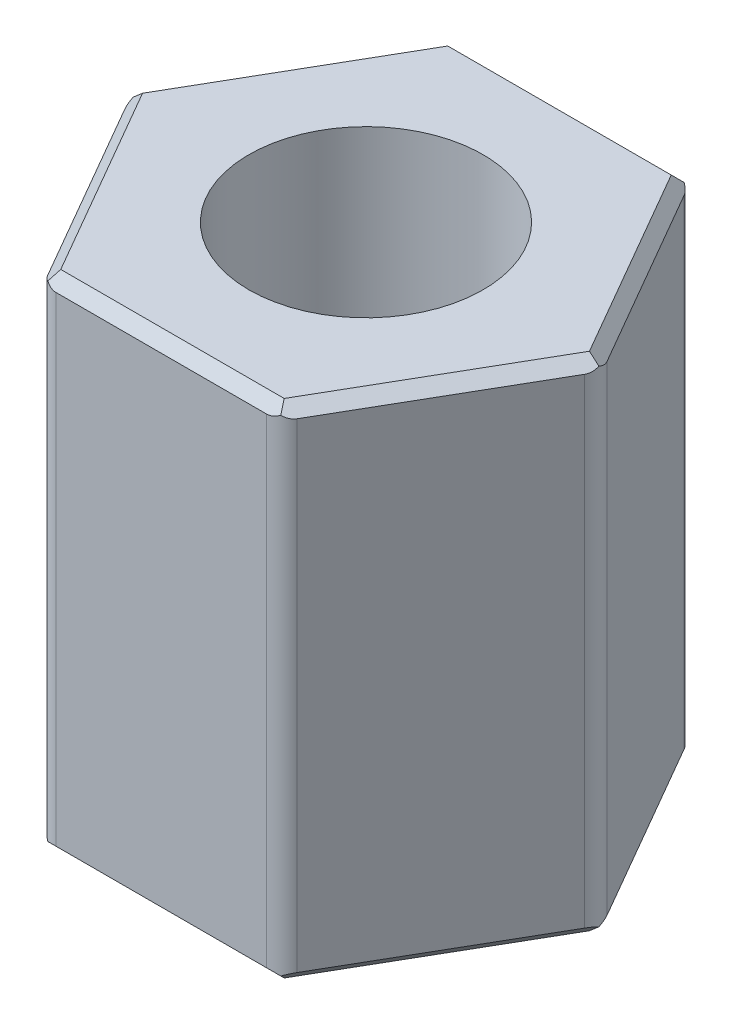
ISO-10303-21;
HEADER;
FILE_DESCRIPTION(('STEP AP214'),'2;1');
FILE_NAME('part.step','',(''),(''),'','','');
FILE_SCHEMA(('AUTOMOTIVE_DESIGN { 1 0 10303 214 1 1 1 1 }'));
ENDSEC;
DATA;
#1=APPLICATION_CONTEXT('core data for automotive mechanical design processes');
#2=APPLICATION_PROTOCOL_DEFINITION('international standard','automotive_design',2000,#1);
#3=PRODUCT_CONTEXT('',#1,'mechanical');
#4=PRODUCT('Part','Part','',(#3));
#5=PRODUCT_RELATED_PRODUCT_CATEGORY('part','',(#4));
#6=PRODUCT_DEFINITION_FORMATION('','',#4);
#7=PRODUCT_DEFINITION_CONTEXT('part definition',#1,'design');
#8=PRODUCT_DEFINITION('design','',#6,#7);
#9=PRODUCT_DEFINITION_SHAPE('','',#8);
#10=(LENGTH_UNIT() NAMED_UNIT(*) SI_UNIT(.MILLI.,.METRE.));
#11=(NAMED_UNIT(*) PLANE_ANGLE_UNIT() SI_UNIT($,.RADIAN.));
#12=(NAMED_UNIT(*) SI_UNIT($,.STERADIAN.) SOLID_ANGLE_UNIT());
#13=UNCERTAINTY_MEASURE_WITH_UNIT(LENGTH_MEASURE(1.E-05),#10,'distance_accuracy_value','');
#14=(GEOMETRIC_REPRESENTATION_CONTEXT(3) GLOBAL_UNCERTAINTY_ASSIGNED_CONTEXT((#13)) GLOBAL_UNIT_ASSIGNED_CONTEXT((#10,
#11,#12)) REPRESENTATION_CONTEXT('',''));
#15=CARTESIAN_POINT('',(0.,0.,0.));
#16=DIRECTION('',(0.,0.,1.));
#17=DIRECTION('',(1.,0.,0.));
#18=AXIS2_PLACEMENT_3D('',#15,#16,#17);
#19=CARTESIAN_POINT('',(0.,11.43,0.));
#20=DIRECTION('',(0.,1.,0.));
#21=DIRECTION('',(0.,0.,1.));
#22=AXIS2_PLACEMENT_3D('',#19,#20,#21);
#23=PLANE('',#22);
#24=DIRECTION('',(-1.,0.,0.));
#25=VECTOR('',#24,1.);
#26=CARTESIAN_POINT('',(-2.69097186966593,11.43,-4.4069));
#27=LINE('',#26,#25);
#28=CARTESIAN_POINT('',(2.54432490129176,11.43,-4.4069));
#29=VERTEX_POINT('',#28);
#30=CARTESIAN_POINT('',(-2.54432490129176,11.43,-4.4069));
#31=VERTEX_POINT('',#30);
#32=EDGE_CURVE('E266',#29,#31,#27,.T.);
#33=ORIENTED_EDGE('',*,*,#32,.T.);
#34=DIRECTION('',(-0.5,0.,0.866025403784439));
#35=VECTOR('',#34,1.);
#36=CARTESIAN_POINT('',(-5.1619732867706,11.43,0.127));
#37=LINE('',#36,#35);
#38=CARTESIAN_POINT('',(-5.08864980258352,11.43,0.));
#39=VERTEX_POINT('',#38);
#40=EDGE_CURVE('E268',#31,#39,#37,.T.);
#41=ORIENTED_EDGE('',*,*,#40,.T.);
#42=DIRECTION('',(0.5,0.,0.866025403784439));
#43=VECTOR('',#42,1.);
#44=CARTESIAN_POINT('',(-2.47100141710468,11.43,4.5339));
#45=LINE('',#44,#43);
#46=CARTESIAN_POINT('',(-2.54432490129176,11.43,4.4069));
#47=VERTEX_POINT('',#46);
#48=EDGE_CURVE('E261',#39,#47,#45,.T.);
#49=ORIENTED_EDGE('',*,*,#48,.T.);
#50=DIRECTION('',(1.,0.,0.));
#51=VECTOR('',#50,1.);
#52=CARTESIAN_POINT('',(2.69097186966593,11.43,4.4069));
#53=LINE('',#52,#51);
#54=CARTESIAN_POINT('',(2.54432490129176,11.43,4.4069));
#55=VERTEX_POINT('',#54);
#56=EDGE_CURVE('E258',#47,#55,#53,.T.);
#57=ORIENTED_EDGE('',*,*,#56,.T.);
#58=DIRECTION('',(0.5,0.,-0.866025403784439));
#59=VECTOR('',#58,1.);
#60=CARTESIAN_POINT('',(5.1619732867706,11.43,-0.127000000000001));
#61=LINE('',#60,#59);
#62=CARTESIAN_POINT('',(5.08864980258352,11.43,0.));
#63=VERTEX_POINT('',#62);
#64=EDGE_CURVE('E256',#55,#63,#61,.T.);
#65=ORIENTED_EDGE('',*,*,#64,.T.);
#66=DIRECTION('',(-0.5,0.,-0.866025403784439));
#67=VECTOR('',#66,1.);
#68=CARTESIAN_POINT('',(2.47100141710467,11.43,-4.5339));
#69=LINE('',#68,#67);
#70=EDGE_CURVE('E264',#63,#29,#69,.T.);
#71=ORIENTED_EDGE('',*,*,#70,.T.);
#72=EDGE_LOOP('',(#33,#41,#49,#57,#65,#71));
#73=FACE_BOUND('',#72,.T.);
#74=CARTESIAN_POINT('',(0.,11.43,0.));
#75=DIRECTION('',(0.,1.,0.));
#76=DIRECTION('',(0.,0.,1.));
#77=AXIS2_PLACEMENT_3D('',#74,#75,#76);
#78=CIRCLE('',#77,2.667);
#79=CARTESIAN_POINT('',(0.,11.43,2.667));
#80=VERTEX_POINT('',#79);
#81=EDGE_CURVE('E427',#80,#80,#78,.T.);
#82=ORIENTED_EDGE('',*,*,#81,.F.);
#83=EDGE_LOOP('',(#82));
#84=FACE_BOUND('',#83,.T.);
#85=ADVANCED_FACE('F33',(#73,#84),#23,.T.);
#86=CARTESIAN_POINT('',(0.,0.,0.));
#87=DIRECTION('',(0.,1.,0.));
#88=DIRECTION('',(0.,0.,1.));
#89=AXIS2_PLACEMENT_3D('',#86,#87,#88);
#90=PLANE('',#89);
#91=DIRECTION('',(0.5,0.,0.866025403784439));
#92=VECTOR('',#91,1.);
#93=CARTESIAN_POINT('',(3.81648735193764,0.,-2.20345));
#94=LINE('',#93,#92);
#95=CARTESIAN_POINT('',(2.54432490129176,0.,-4.4069));
#96=VERTEX_POINT('',#95);
#97=CARTESIAN_POINT('',(5.08864980258352,0.,0.));
#98=VERTEX_POINT('',#97);
#99=EDGE_CURVE('E222',#96,#98,#94,.T.);
#100=ORIENTED_EDGE('',*,*,#99,.T.);
#101=DIRECTION('',(-0.5,0.,0.866025403784439));
#102=VECTOR('',#101,1.);
#103=CARTESIAN_POINT('',(3.81648735193764,0.,2.20345));
#104=LINE('',#103,#102);
#105=CARTESIAN_POINT('',(2.54432490129176,0.,4.4069));
#106=VERTEX_POINT('',#105);
#107=EDGE_CURVE('E199',#98,#106,#104,.T.);
#108=ORIENTED_EDGE('',*,*,#107,.T.);
#109=DIRECTION('',(-1.,0.,0.));
#110=VECTOR('',#109,1.);
#111=CARTESIAN_POINT('',(0.,0.,4.4069));
#112=LINE('',#111,#110);
#113=CARTESIAN_POINT('',(-2.54432490129176,0.,4.4069));
#114=VERTEX_POINT('',#113);
#115=EDGE_CURVE('E209',#106,#114,#112,.T.);
#116=ORIENTED_EDGE('',*,*,#115,.T.);
#117=DIRECTION('',(-0.5,0.,-0.866025403784439));
#118=VECTOR('',#117,1.);
#119=CARTESIAN_POINT('',(-3.81648735193764,0.,2.20345));
#120=LINE('',#119,#118);
#121=CARTESIAN_POINT('',(-5.08864980258353,0.,0.));
#122=VERTEX_POINT('',#121);
#123=EDGE_CURVE('E216',#114,#122,#120,.T.);
#124=ORIENTED_EDGE('',*,*,#123,.T.);
#125=DIRECTION('',(0.5,0.,-0.866025403784439));
#126=VECTOR('',#125,1.);
#127=CARTESIAN_POINT('',(-3.81648735193764,0.,-2.20345));
#128=LINE('',#127,#126);
#129=CARTESIAN_POINT('',(-2.54432490129176,0.,-4.4069));
#130=VERTEX_POINT('',#129);
#131=EDGE_CURVE('E434',#122,#130,#128,.T.);
#132=ORIENTED_EDGE('',*,*,#131,.T.);
#133=DIRECTION('',(1.,0.,0.));
#134=VECTOR('',#133,1.);
#135=CARTESIAN_POINT('',(0.,0.,-4.4069));
#136=LINE('',#135,#134);
#137=EDGE_CURVE('E228',#130,#96,#136,.T.);
#138=ORIENTED_EDGE('',*,*,#137,.T.);
#139=EDGE_LOOP('',(#100,#108,#116,#124,#132,#138));
#140=FACE_BOUND('',#139,.T.);
#141=CARTESIAN_POINT('',(0.,0.,0.));
#142=DIRECTION('',(0.,1.,0.));
#143=DIRECTION('',(0.,0.,1.));
#144=AXIS2_PLACEMENT_3D('',#141,#142,#143);
#145=CIRCLE('',#144,2.667);
#146=CARTESIAN_POINT('',(0.,0.,2.667));
#147=VERTEX_POINT('',#146);
#148=EDGE_CURVE('E282',#147,#147,#145,.T.);
#149=ORIENTED_EDGE('',*,*,#148,.T.);
#150=EDGE_LOOP('',(#149));
#151=FACE_BOUND('',#150,.T.);
#152=ADVANCED_FACE('F219',(#140,#151),#90,.F.);
#153=CARTESIAN_POINT('',(-2.69097186966593,11.43,4.6609));
#154=DIRECTION('',(0.,0.,-1.));
#155=DIRECTION('',(-1.,0.,0.));
#156=AXIS2_PLACEMENT_3D('',#153,#154,#155);
#157=PLANE('',#156);
#158=DIRECTION('',(1.,0.,0.));
#159=VECTOR('',#158,1.);
#160=CARTESIAN_POINT('',(-2.69097186966593,0.253999999999999,4.6609));
#161=LINE('',#160,#159);
#162=CARTESIAN_POINT('',(-2.3976779329176,0.253999999999999,4.6609));
#163=VERTEX_POINT('',#162);
#164=CARTESIAN_POINT('',(2.3976779329176,0.253999999999999,4.6609));
#165=VERTEX_POINT('',#164);
#166=EDGE_CURVE('E253',#163,#165,#161,.T.);
#167=ORIENTED_EDGE('',*,*,#166,.T.);
#168=DIRECTION('',(0.,-1.,0.));
#169=VECTOR('',#168,1.);
#170=CARTESIAN_POINT('',(2.3976779329176,11.43,4.6609));
#171=LINE('',#170,#169);
#172=CARTESIAN_POINT('',(2.3976779329176,11.176,4.6609));
#173=VERTEX_POINT('',#172);
#174=EDGE_CURVE('E327',#165,#173,#171,.F.);
#175=ORIENTED_EDGE('',*,*,#174,.T.);
#176=DIRECTION('',(-1.,0.,0.));
#177=VECTOR('',#176,1.);
#178=CARTESIAN_POINT('',(-2.69097186966593,11.176,4.6609));
#179=LINE('',#178,#177);
#180=CARTESIAN_POINT('',(-2.3976779329176,11.176,4.6609));
#181=VERTEX_POINT('',#180);
#182=EDGE_CURVE('E250',#173,#181,#179,.T.);
#183=ORIENTED_EDGE('',*,*,#182,.T.);
#184=DIRECTION('',(0.,-1.,0.));
#185=VECTOR('',#184,1.);
#186=CARTESIAN_POINT('',(-2.3976779329176,11.43,4.6609));
#187=LINE('',#186,#185);
#188=EDGE_CURVE('E324',#181,#163,#187,.T.);
#189=ORIENTED_EDGE('',*,*,#188,.T.);
#190=EDGE_LOOP('',(#167,#175,#183,#189));
#191=FACE_BOUND('',#190,.T.);
#192=ADVANCED_FACE('F465',(#191),#157,.F.);
#193=CARTESIAN_POINT('',(2.69097186966593,11.43,4.6609));
#194=DIRECTION('',(-0.866025403784439,0.,-0.5));
#195=DIRECTION('',(-0.5,0.,0.866025403784439));
#196=AXIS2_PLACEMENT_3D('',#193,#194,#195);
#197=PLANE('',#196);
#198=DIRECTION('',(0.5,0.,-0.866025403784439));
#199=VECTOR('',#198,1.);
#200=CARTESIAN_POINT('',(2.69097186966593,0.253999999999999,4.6609));
#201=LINE('',#200,#199);
#202=CARTESIAN_POINT('',(2.83761883804009,0.253999999999999,4.4069));
#203=VERTEX_POINT('',#202);
#204=CARTESIAN_POINT('',(5.23529677095769,0.253999999999999,0.253999999999999));
#205=VERTEX_POINT('',#204);
#206=EDGE_CURVE('E217',#203,#205,#201,.T.);
#207=ORIENTED_EDGE('',*,*,#206,.T.);
#208=DIRECTION('',(0.,-1.,0.));
#209=VECTOR('',#208,1.);
#210=CARTESIAN_POINT('',(5.23529677095769,11.43,0.254000000000001));
#211=LINE('',#210,#209);
#212=CARTESIAN_POINT('',(5.23529677095769,11.176,0.253999999999999));
#213=VERTEX_POINT('',#212);
#214=EDGE_CURVE('E310',#205,#213,#211,.F.);
#215=ORIENTED_EDGE('',*,*,#214,.T.);
#216=DIRECTION('',(-0.5,0.,0.866025403784439));
#217=VECTOR('',#216,1.);
#218=CARTESIAN_POINT('',(2.69097186966593,11.176,4.6609));
#219=LINE('',#218,#217);
#220=CARTESIAN_POINT('',(2.83761883804009,11.176,4.4069));
#221=VERTEX_POINT('',#220);
#222=EDGE_CURVE('E419',#213,#221,#219,.T.);
#223=ORIENTED_EDGE('',*,*,#222,.T.);
#224=DIRECTION('',(0.,-1.,0.));
#225=VECTOR('',#224,1.);
#226=CARTESIAN_POINT('',(2.83761883804009,11.43,4.4069));
#227=LINE('',#226,#225);
#228=EDGE_CURVE('E307',#221,#203,#227,.T.);
#229=ORIENTED_EDGE('',*,*,#228,.T.);
#230=EDGE_LOOP('',(#207,#215,#223,#229));
#231=FACE_BOUND('',#230,.T.);
#232=ADVANCED_FACE('F415',(#231),#197,.F.);
#233=CARTESIAN_POINT('',(5.38194373933185,11.43,0.));
#234=DIRECTION('',(-0.866025403784438,0.,0.5));
#235=DIRECTION('',(0.5,0.,0.866025403784439));
#236=AXIS2_PLACEMENT_3D('',#233,#234,#235);
#237=PLANE('',#236);
#238=DIRECTION('',(0.5,0.,0.866025403784439));
#239=VECTOR('',#238,1.);
#240=CARTESIAN_POINT('',(5.38194373933185,11.176,0.));
#241=LINE('',#240,#239);
#242=CARTESIAN_POINT('',(2.83761883804009,11.176,-4.4069));
#243=VERTEX_POINT('',#242);
#244=CARTESIAN_POINT('',(5.23529677095769,11.176,-0.253999999999999));
#245=VERTEX_POINT('',#244);
#246=EDGE_CURVE('E223',#243,#245,#241,.T.);
#247=ORIENTED_EDGE('',*,*,#246,.T.);
#248=DIRECTION('',(0.,-1.,0.));
#249=VECTOR('',#248,1.);
#250=CARTESIAN_POINT('',(5.23529677095769,11.43,-0.253999999999999));
#251=LINE('',#250,#249);
#252=CARTESIAN_POINT('',(5.23529677095769,0.253999999999999,-0.253999999999999));
#253=VERTEX_POINT('',#252);
#254=EDGE_CURVE('E297',#245,#253,#251,.T.);
#255=ORIENTED_EDGE('',*,*,#254,.T.);
#256=DIRECTION('',(-0.5,0.,-0.866025403784439));
#257=VECTOR('',#256,1.);
#258=CARTESIAN_POINT('',(5.38194373933185,0.253999999999999,0.));
#259=LINE('',#258,#257);
#260=CARTESIAN_POINT('',(2.83761883804009,0.253999999999999,-4.4069));
#261=VERTEX_POINT('',#260);
#262=EDGE_CURVE('E226',#253,#261,#259,.T.);
#263=ORIENTED_EDGE('',*,*,#262,.T.);
#264=DIRECTION('',(0.,-1.,0.));
#265=VECTOR('',#264,1.);
#266=CARTESIAN_POINT('',(2.83761883804009,11.43,-4.4069));
#267=LINE('',#266,#265);
#268=EDGE_CURVE('E271',#261,#243,#267,.F.);
#269=ORIENTED_EDGE('',*,*,#268,.T.);
#270=EDGE_LOOP('',(#247,#255,#263,#269));
#271=FACE_BOUND('',#270,.T.);
#272=ADVANCED_FACE('F404',(#271),#237,.F.);
#273=CARTESIAN_POINT('',(2.69097186966592,11.43,-4.6609));
#274=DIRECTION('',(0.,0.,1.));
#275=DIRECTION('',(1.,0.,0.));
#276=AXIS2_PLACEMENT_3D('',#273,#274,#275);
#277=PLANE('',#276);
#278=DIRECTION('',(-1.,0.,0.));
#279=VECTOR('',#278,1.);
#280=CARTESIAN_POINT('',(2.69097186966592,0.253999999999999,-4.6609));
#281=LINE('',#280,#279);
#282=CARTESIAN_POINT('',(2.39767793291759,0.253999999999999,-4.6609));
#283=VERTEX_POINT('',#282);
#284=CARTESIAN_POINT('',(-2.3976779329176,0.253999999999999,-4.6609));
#285=VERTEX_POINT('',#284);
#286=EDGE_CURVE('E236',#283,#285,#281,.T.);
#287=ORIENTED_EDGE('',*,*,#286,.T.);
#288=DIRECTION('',(0.,-1.,0.));
#289=VECTOR('',#288,1.);
#290=CARTESIAN_POINT('',(-2.3976779329176,11.43,-4.6609));
#291=LINE('',#290,#289);
#292=CARTESIAN_POINT('',(-2.3976779329176,11.176,-4.6609));
#293=VERTEX_POINT('',#292);
#294=EDGE_CURVE('E54',#285,#293,#291,.F.);
#295=ORIENTED_EDGE('',*,*,#294,.T.);
#296=DIRECTION('',(1.,0.,0.));
#297=VECTOR('',#296,1.);
#298=CARTESIAN_POINT('',(2.69097186966592,11.176,-4.6609));
#299=LINE('',#298,#297);
#300=CARTESIAN_POINT('',(2.39767793291759,11.176,-4.6609));
#301=VERTEX_POINT('',#300);
#302=EDGE_CURVE('E234',#293,#301,#299,.T.);
#303=ORIENTED_EDGE('',*,*,#302,.T.);
#304=DIRECTION('',(0.,-1.,0.));
#305=VECTOR('',#304,1.);
#306=CARTESIAN_POINT('',(2.39767793291759,11.43,-4.6609));
#307=LINE('',#306,#305);
#308=EDGE_CURVE('E363',#301,#283,#307,.T.);
#309=ORIENTED_EDGE('',*,*,#308,.T.);
#310=EDGE_LOOP('',(#287,#295,#303,#309));
#311=FACE_BOUND('',#310,.T.);
#312=ADVANCED_FACE('F368',(#311),#277,.F.);
#313=CARTESIAN_POINT('',(-2.69097186966593,11.43,-4.6609));
#314=DIRECTION('',(0.866025403784439,0.,0.5));
#315=DIRECTION('',(0.5,0.,-0.866025403784439));
#316=AXIS2_PLACEMENT_3D('',#313,#314,#315);
#317=PLANE('',#316);
#318=DIRECTION('',(-0.5,0.,0.866025403784439));
#319=VECTOR('',#318,1.);
#320=CARTESIAN_POINT('',(-2.69097186966593,0.253999999999999,-4.6609));
#321=LINE('',#320,#319);
#322=CARTESIAN_POINT('',(-2.83761883804009,0.253999999999999,-4.4069));
#323=VERTEX_POINT('',#322);
#324=CARTESIAN_POINT('',(-5.23529677095769,0.253999999999999,-0.253999999999999));
#325=VERTEX_POINT('',#324);
#326=EDGE_CURVE('E241',#323,#325,#321,.T.);
#327=ORIENTED_EDGE('',*,*,#326,.T.);
#328=DIRECTION('',(0.,-1.,0.));
#329=VECTOR('',#328,1.);
#330=CARTESIAN_POINT('',(-5.23529677095769,11.43,-0.254000000000001));
#331=LINE('',#330,#329);
#332=CARTESIAN_POINT('',(-5.23529677095769,11.176,-0.253999999999999));
#333=VERTEX_POINT('',#332);
#334=EDGE_CURVE('E353',#325,#333,#331,.F.);
#335=ORIENTED_EDGE('',*,*,#334,.T.);
#336=DIRECTION('',(0.5,0.,-0.866025403784439));
#337=VECTOR('',#336,1.);
#338=CARTESIAN_POINT('',(-2.69097186966593,11.176,-4.6609));
#339=LINE('',#338,#337);
#340=CARTESIAN_POINT('',(-2.83761883804009,11.176,-4.4069));
#341=VERTEX_POINT('',#340);
#342=EDGE_CURVE('E238',#333,#341,#339,.T.);
#343=ORIENTED_EDGE('',*,*,#342,.T.);
#344=DIRECTION('',(0.,-1.,0.));
#345=VECTOR('',#344,1.);
#346=CARTESIAN_POINT('',(-2.83761883804009,11.43,-4.4069));
#347=LINE('',#346,#345);
#348=EDGE_CURVE('E350',#341,#323,#347,.T.);
#349=ORIENTED_EDGE('',*,*,#348,.T.);
#350=EDGE_LOOP('',(#327,#335,#343,#349));
#351=FACE_BOUND('',#350,.T.);
#352=ADVANCED_FACE('F443',(#351),#317,.F.);
#353=CARTESIAN_POINT('',(-5.38194373933185,11.43,0.));
#354=DIRECTION('',(0.866025403784439,0.,-0.5));
#355=DIRECTION('',(-0.5,0.,-0.866025403784439));
#356=AXIS2_PLACEMENT_3D('',#353,#354,#355);
#357=PLANE('',#356);
#358=DIRECTION('',(0.5,0.,0.866025403784439));
#359=VECTOR('',#358,1.);
#360=CARTESIAN_POINT('',(-5.38194373933185,0.253999999999999,0.));
#361=LINE('',#360,#359);
#362=CARTESIAN_POINT('',(-5.23529677095769,0.253999999999999,0.253999999999999));
#363=VERTEX_POINT('',#362);
#364=CARTESIAN_POINT('',(-2.83761883804009,0.253999999999999,4.4069));
#365=VERTEX_POINT('',#364);
#366=EDGE_CURVE('E247',#363,#365,#361,.T.);
#367=ORIENTED_EDGE('',*,*,#366,.T.);
#368=DIRECTION('',(0.,-1.,0.));
#369=VECTOR('',#368,1.);
#370=CARTESIAN_POINT('',(-2.83761883804009,11.43,4.4069));
#371=LINE('',#370,#369);
#372=CARTESIAN_POINT('',(-2.83761883804009,11.176,4.4069));
#373=VERTEX_POINT('',#372);
#374=EDGE_CURVE('E340',#365,#373,#371,.F.);
#375=ORIENTED_EDGE('',*,*,#374,.T.);
#376=DIRECTION('',(-0.5,0.,-0.866025403784439));
#377=VECTOR('',#376,1.);
#378=CARTESIAN_POINT('',(-5.38194373933185,11.176,0.));
#379=LINE('',#378,#377);
#380=CARTESIAN_POINT('',(-5.23529677095769,11.176,0.253999999999999));
#381=VERTEX_POINT('',#380);
#382=EDGE_CURVE('E244',#373,#381,#379,.T.);
#383=ORIENTED_EDGE('',*,*,#382,.T.);
#384=DIRECTION('',(0.,-1.,0.));
#385=VECTOR('',#384,1.);
#386=CARTESIAN_POINT('',(-5.23529677095769,11.43,0.253999999999999));
#387=LINE('',#386,#385);
#388=EDGE_CURVE('E337',#381,#363,#387,.T.);
#389=ORIENTED_EDGE('',*,*,#388,.T.);
#390=EDGE_LOOP('',(#367,#375,#383,#389));
#391=FACE_BOUND('',#390,.T.);
#392=ADVANCED_FACE('F487',(#391),#357,.F.);
#393=CARTESIAN_POINT('',(0.,11.43,0.));
#394=DIRECTION('',(0.,-1.,0.));
#395=DIRECTION('',(0.,0.,-1.));
#396=AXIS2_PLACEMENT_3D('',#393,#394,#395);
#397=CYLINDRICAL_SURFACE('',#396,2.667);
#398=ORIENTED_EDGE('',*,*,#81,.T.);
#399=EDGE_LOOP('',(#398));
#400=FACE_BOUND('',#399,.T.);
#401=ORIENTED_EDGE('',*,*,#148,.F.);
#402=EDGE_LOOP('',(#401));
#403=FACE_BOUND('',#402,.T.);
#404=ADVANCED_FACE('F485',(#400,#403),#397,.F.);
#405=CARTESIAN_POINT('',(-2.69097186966593,0.253999999999999,-4.6609));
#406=DIRECTION('',(0.612372435695794,0.707106781186548,0.353553390593274));
#407=DIRECTION('',(-0.5,0.,0.866025403784439));
#408=AXIS2_PLACEMENT_3D('',#405,#406,#407);
#409=PLANE('',#408);
#410=DIRECTION('',(0.755928946018455,-0.654653670707977,0.));
#411=VECTOR('',#410,1.);
#412=CARTESIAN_POINT('',(-5.38194373933185,0.253999999999999,0.));
#413=LINE('',#412,#411);
#414=CARTESIAN_POINT('',(-5.30335586583519,0.185940905122494,0.));
#415=VERTEX_POINT('',#414);
#416=EDGE_CURVE('E280',#415,#122,#413,.T.);
#417=ORIENTED_EDGE('',*,*,#416,.F.);
#418=CARTESIAN_POINT('',(-4.79535586583519,-0.253999999999999,0.));
#419=DIRECTION('',(0.612372435695794,0.707106781186548,0.353553390593274));
#420=DIRECTION('',(0.612372435695795,-0.707106781186547,0.353553390593274));
#421=AXIS2_PLACEMENT_3D('',#418,#419,#420);
#422=ELLIPSE('',#421,0.718420489685532,0.508);
#423=EDGE_CURVE('E348',#415,#325,#422,.F.);
#424=ORIENTED_EDGE('',*,*,#423,.T.);
#425=ORIENTED_EDGE('',*,*,#326,.F.);
#426=CARTESIAN_POINT('',(-2.3976779329176,-0.253999999999999,-4.1529));
#427=DIRECTION('',(0.612372435695794,0.707106781186548,0.353553390593274));
#428=DIRECTION('',(0.612372435695795,-0.707106781186547,0.353553390593274));
#429=AXIS2_PLACEMENT_3D('',#426,#427,#428);
#430=ELLIPSE('',#429,0.718420489685532,0.508);
#431=CARTESIAN_POINT('',(-2.6516779329176,0.185940905122494,-4.5928409051225));
#432=VERTEX_POINT('',#431);
#433=EDGE_CURVE('E346',#323,#432,#430,.F.);
#434=ORIENTED_EDGE('',*,*,#433,.T.);
#435=DIRECTION('',(0.377964473009227,-0.654653670707977,0.654653670707978));
#436=VECTOR('',#435,1.);
#437=CARTESIAN_POINT('',(-2.69097186966593,0.253999999999999,-4.6609));
#438=LINE('',#437,#436);
#439=EDGE_CURVE('E277',#130,#432,#438,.F.);
#440=ORIENTED_EDGE('',*,*,#439,.F.);
#441=ORIENTED_EDGE('',*,*,#131,.F.);
#442=EDGE_LOOP('',(#417,#424,#425,#434,#440,#441));
#443=FACE_BOUND('',#442,.T.);
#444=ADVANCED_FACE('F438',(#443),#409,.F.);
#445=CARTESIAN_POINT('',(-5.38194373933185,0.253999999999999,0.));
#446=DIRECTION('',(0.612372435695795,0.707106781186547,-0.353553390593274));
#447=DIRECTION('',(0.5,0.,0.866025403784439));
#448=AXIS2_PLACEMENT_3D('',#445,#446,#447);
#449=PLANE('',#448);
#450=DIRECTION('',(0.377964473009227,-0.654653670707977,-0.654653670707977));
#451=VECTOR('',#450,1.);
#452=CARTESIAN_POINT('',(-2.69097186966593,0.253999999999999,4.6609));
#453=LINE('',#452,#451);
#454=CARTESIAN_POINT('',(-2.6516779329176,0.185940905122494,4.59284090512249));
#455=VERTEX_POINT('',#454);
#456=EDGE_CURVE('E212',#455,#114,#453,.T.);
#457=ORIENTED_EDGE('',*,*,#456,.F.);
#458=CARTESIAN_POINT('',(-2.3976779329176,-0.254000000000001,4.1529));
#459=DIRECTION('',(0.612372435695795,0.707106781186547,-0.353553390593274));
#460=DIRECTION('',(0.612372435695794,-0.707106781186548,-0.353553390593274));
#461=AXIS2_PLACEMENT_3D('',#458,#459,#460);
#462=ELLIPSE('',#461,0.718420489685533,0.508);
#463=EDGE_CURVE('E335',#455,#365,#462,.F.);
#464=ORIENTED_EDGE('',*,*,#463,.T.);
#465=ORIENTED_EDGE('',*,*,#366,.F.);
#466=CARTESIAN_POINT('',(-4.79535586583519,-0.254000000000001,0.));
#467=DIRECTION('',(0.612372435695795,0.707106781186547,-0.353553390593274));
#468=DIRECTION('',(0.612372435695794,-0.707106781186548,-0.353553390593274));
#469=AXIS2_PLACEMENT_3D('',#466,#467,#468);
#470=ELLIPSE('',#469,0.718420489685533,0.508);
#471=EDGE_CURVE('E333',#363,#415,#470,.F.);
#472=ORIENTED_EDGE('',*,*,#471,.T.);
#473=ORIENTED_EDGE('',*,*,#416,.T.);
#474=ORIENTED_EDGE('',*,*,#123,.F.);
#475=EDGE_LOOP('',(#457,#464,#465,#472,#473,#474));
#476=FACE_BOUND('',#475,.T.);
#477=ADVANCED_FACE('F509',(#476),#449,.F.);
#478=CARTESIAN_POINT('',(2.69097186966592,0.253999999999999,-4.6609));
#479=DIRECTION('',(0.,0.707106781186548,0.707106781186547));
#480=DIRECTION('',(-1.,0.,0.));
#481=AXIS2_PLACEMENT_3D('',#478,#479,#480);
#482=PLANE('',#481);
#483=ORIENTED_EDGE('',*,*,#439,.T.);
#484=CARTESIAN_POINT('',(-2.3976779329176,-0.254000000000001,-4.1529));
#485=DIRECTION('',(0.,0.707106781186548,0.707106781186547));
#486=DIRECTION('',(0.,-0.707106781186547,0.707106781186548));
#487=AXIS2_PLACEMENT_3D('',#484,#485,#486);
#488=ELLIPSE('',#487,0.718420489685532,0.508);
#489=EDGE_CURVE('E361',#432,#285,#488,.F.);
#490=ORIENTED_EDGE('',*,*,#489,.T.);
#491=ORIENTED_EDGE('',*,*,#286,.F.);
#492=CARTESIAN_POINT('',(2.39767793291759,-0.254000000000001,-4.1529));
#493=DIRECTION('',(0.,0.707106781186548,0.707106781186547));
#494=DIRECTION('',(0.,-0.707106781186547,0.707106781186548));
#495=AXIS2_PLACEMENT_3D('',#492,#493,#494);
#496=ELLIPSE('',#495,0.718420489685532,0.508);
#497=CARTESIAN_POINT('',(2.65167793291759,0.185940905122494,-4.5928409051225));
#498=VERTEX_POINT('',#497);
#499=EDGE_CURVE('E359',#283,#498,#496,.F.);
#500=ORIENTED_EDGE('',*,*,#499,.T.);
#501=DIRECTION('',(-0.377964473009225,-0.654653670707977,0.654653670707978));
#502=VECTOR('',#501,1.);
#503=CARTESIAN_POINT('',(2.69097186966592,0.253999999999999,-4.6609));
#504=LINE('',#503,#502);
#505=EDGE_CURVE('E205',#96,#498,#504,.F.);
#506=ORIENTED_EDGE('',*,*,#505,.F.);
#507=ORIENTED_EDGE('',*,*,#137,.F.);
#508=EDGE_LOOP('',(#483,#490,#491,#500,#506,#507));
#509=FACE_BOUND('',#508,.T.);
#510=ADVANCED_FACE('F371',(#509),#482,.F.);
#511=CARTESIAN_POINT('',(-2.69097186966593,0.253999999999999,4.6609));
#512=DIRECTION('',(0.,0.707106781186548,-0.707106781186548));
#513=DIRECTION('',(1.,0.,0.));
#514=AXIS2_PLACEMENT_3D('',#511,#512,#513);
#515=PLANE('',#514);
#516=DIRECTION('',(0.377964473009228,0.654653670707977,0.654653670707977));
#517=VECTOR('',#516,1.);
#518=CARTESIAN_POINT('',(1.92212276404709,-1.07768571428572,3.32921428571428));
#519=LINE('',#518,#517);
#520=CARTESIAN_POINT('',(2.65167793291759,0.185940905122492,4.59284090512249));
#521=VERTEX_POINT('',#520);
#522=EDGE_CURVE('E194',#521,#106,#519,.F.);
#523=ORIENTED_EDGE('',*,*,#522,.F.);
#524=CARTESIAN_POINT('',(2.3976779329176,-0.254000000000003,4.1529));
#525=DIRECTION('',(0.,0.707106781186548,-0.707106781186548));
#526=DIRECTION('',(0.,-0.707106781186548,-0.707106781186548));
#527=AXIS2_PLACEMENT_3D('',#524,#525,#526);
#528=ELLIPSE('',#527,0.718420489685532,0.508);
#529=EDGE_CURVE('E322',#521,#165,#528,.F.);
#530=ORIENTED_EDGE('',*,*,#529,.T.);
#531=ORIENTED_EDGE('',*,*,#166,.F.);
#532=CARTESIAN_POINT('',(-2.3976779329176,-0.254000000000003,4.1529));
#533=DIRECTION('',(0.,0.707106781186548,-0.707106781186548));
#534=DIRECTION('',(0.,-0.707106781186548,-0.707106781186548));
#535=AXIS2_PLACEMENT_3D('',#532,#533,#534);
#536=ELLIPSE('',#535,0.718420489685532,0.508);
#537=EDGE_CURVE('E320',#163,#455,#536,.F.);
#538=ORIENTED_EDGE('',*,*,#537,.T.);
#539=ORIENTED_EDGE('',*,*,#456,.T.);
#540=ORIENTED_EDGE('',*,*,#115,.F.);
#541=EDGE_LOOP('',(#523,#530,#531,#538,#539,#540));
#542=FACE_BOUND('',#541,.T.);
#543=ADVANCED_FACE('F210',(#542),#515,.F.);
#544=CARTESIAN_POINT('',(5.38194373933185,0.253999999999999,0.));
#545=DIRECTION('',(-0.612372435695795,0.707106781186547,0.353553390593274));
#546=DIRECTION('',(-0.5,0.,-0.866025403784439));
#547=AXIS2_PLACEMENT_3D('',#544,#545,#546);
#548=PLANE('',#547);
#549=ORIENTED_EDGE('',*,*,#262,.F.);
#550=CARTESIAN_POINT('',(4.79535586583519,-0.254000000000001,0.));
#551=DIRECTION('',(-0.612372435695795,0.707106781186547,0.353553390593274));
#552=DIRECTION('',(-0.612372435695794,-0.707106781186548,0.353553390593274));
#553=AXIS2_PLACEMENT_3D('',#550,#551,#552);
#554=ELLIPSE('',#553,0.718420489685533,0.508);
#555=CARTESIAN_POINT('',(5.30335586583519,0.185940905122494,0.));
#556=VERTEX_POINT('',#555);
#557=EDGE_CURVE('E302',#253,#556,#554,.F.);
#558=ORIENTED_EDGE('',*,*,#557,.T.);
#559=DIRECTION('',(-0.755928946018455,-0.654653670707977,0.));
#560=VECTOR('',#559,1.);
#561=CARTESIAN_POINT('',(5.38194373933185,0.253999999999999,0.));
#562=LINE('',#561,#560);
#563=EDGE_CURVE('E206',#98,#556,#562,.F.);
#564=ORIENTED_EDGE('',*,*,#563,.F.);
#565=ORIENTED_EDGE('',*,*,#99,.F.);
#566=ORIENTED_EDGE('',*,*,#505,.T.);
#567=CARTESIAN_POINT('',(2.39767793291759,-0.254000000000001,-4.1529));
#568=DIRECTION('',(-0.612372435695795,0.707106781186547,0.353553390593274));
#569=DIRECTION('',(-0.612372435695794,-0.707106781186548,0.353553390593274));
#570=AXIS2_PLACEMENT_3D('',#567,#568,#569);
#571=ELLIPSE('',#570,0.718420489685533,0.508);
#572=EDGE_CURVE('E300',#498,#261,#571,.F.);
#573=ORIENTED_EDGE('',*,*,#572,.T.);
#574=EDGE_LOOP('',(#549,#558,#564,#565,#566,#573));
#575=FACE_BOUND('',#574,.T.);
#576=ADVANCED_FACE('F412',(#575),#548,.F.);
#577=CARTESIAN_POINT('',(2.69097186966593,0.253999999999999,4.6609));
#578=DIRECTION('',(-0.612372435695794,0.707106781186548,-0.353553390593274));
#579=DIRECTION('',(0.5,0.,-0.866025403784439));
#580=AXIS2_PLACEMENT_3D('',#577,#578,#579);
#581=PLANE('',#580);
#582=ORIENTED_EDGE('',*,*,#563,.T.);
#583=CARTESIAN_POINT('',(4.79535586583519,-0.253999999999999,0.));
#584=DIRECTION('',(-0.612372435695794,0.707106781186548,-0.353553390593274));
#585=DIRECTION('',(-0.612372435695795,-0.707106781186547,-0.353553390593274));
#586=AXIS2_PLACEMENT_3D('',#583,#584,#585);
#587=ELLIPSE('',#586,0.718420489685532,0.508);
#588=EDGE_CURVE('E305',#556,#205,#587,.F.);
#589=ORIENTED_EDGE('',*,*,#588,.T.);
#590=ORIENTED_EDGE('',*,*,#206,.F.);
#591=CARTESIAN_POINT('',(2.3976779329176,-0.253999999999999,4.1529));
#592=DIRECTION('',(-0.612372435695794,0.707106781186548,-0.353553390593274));
#593=DIRECTION('',(-0.612372435695795,-0.707106781186547,-0.353553390593274));
#594=AXIS2_PLACEMENT_3D('',#591,#592,#593);
#595=ELLIPSE('',#594,0.718420489685532,0.508);
#596=EDGE_CURVE('E202',#203,#521,#595,.F.);
#597=ORIENTED_EDGE('',*,*,#596,.T.);
#598=ORIENTED_EDGE('',*,*,#522,.T.);
#599=ORIENTED_EDGE('',*,*,#107,.F.);
#600=EDGE_LOOP('',(#582,#589,#590,#597,#598,#599));
#601=FACE_BOUND('',#600,.T.);
#602=ADVANCED_FACE('F197',(#601),#581,.F.);
#603=CARTESIAN_POINT('',(3.81648735193764,11.43,2.20345));
#604=DIRECTION('',(0.612372435695794,0.707106781186548,0.353553390593274));
#605=DIRECTION('',(-0.5,0.,0.866025403784439));
#606=AXIS2_PLACEMENT_3D('',#603,#604,#605);
#607=PLANE('',#606);
#608=ORIENTED_EDGE('',*,*,#222,.F.);
#609=CARTESIAN_POINT('',(4.79535586583519,11.684,0.));
#610=DIRECTION('',(0.612372435695794,0.707106781186548,0.353553390593274));
#611=DIRECTION('',(0.612372435695795,-0.707106781186547,0.353553390593274));
#612=AXIS2_PLACEMENT_3D('',#609,#610,#611);
#613=ELLIPSE('',#612,0.718420489685532,0.508);
#614=CARTESIAN_POINT('',(5.30335586583519,11.2440590948775,0.));
#615=VERTEX_POINT('',#614);
#616=EDGE_CURVE('E314',#213,#615,#613,.T.);
#617=ORIENTED_EDGE('',*,*,#616,.T.);
#618=DIRECTION('',(-0.755928946018455,0.654653670707977,0.));
#619=VECTOR('',#618,1.);
#620=CARTESIAN_POINT('',(4.36169983078588,12.0595571428571,0.));
#621=LINE('',#620,#619);
#622=EDGE_CURVE('E272',#63,#615,#621,.F.);
#623=ORIENTED_EDGE('',*,*,#622,.F.);
#624=ORIENTED_EDGE('',*,*,#64,.F.);
#625=DIRECTION('',(0.37796447300923,-0.654653670707978,0.654653670707975));
#626=VECTOR('',#625,1.);
#627=CARTESIAN_POINT('',(2.18084991539294,12.0595571428571,3.77734285714286));
#628=LINE('',#627,#626);
#629=CARTESIAN_POINT('',(2.6516779329176,11.2440590948775,4.59284090512249));
#630=VERTEX_POINT('',#629);
#631=EDGE_CURVE('E292',#630,#55,#628,.F.);
#632=ORIENTED_EDGE('',*,*,#631,.F.);
#633=CARTESIAN_POINT('',(2.3976779329176,11.684,4.1529));
#634=DIRECTION('',(0.612372435695794,0.707106781186548,0.353553390593274));
#635=DIRECTION('',(0.612372435695795,-0.707106781186547,0.353553390593274));
#636=AXIS2_PLACEMENT_3D('',#633,#634,#635);
#637=ELLIPSE('',#636,0.718420489685532,0.508);
#638=EDGE_CURVE('E312',#630,#221,#637,.T.);
#639=ORIENTED_EDGE('',*,*,#638,.T.);
#640=EDGE_LOOP('',(#608,#617,#623,#624,#632,#639));
#641=FACE_BOUND('',#640,.T.);
#642=ADVANCED_FACE('F423',(#641),#607,.T.);
#643=CARTESIAN_POINT('',(3.81648735193764,11.43,-2.20345));
#644=DIRECTION('',(0.612372435695795,0.707106781186547,-0.353553390593274));
#645=DIRECTION('',(0.5,0.,0.866025403784439));
#646=AXIS2_PLACEMENT_3D('',#643,#644,#645);
#647=PLANE('',#646);
#648=ORIENTED_EDGE('',*,*,#622,.T.);
#649=CARTESIAN_POINT('',(4.79535586583519,11.684,0.));
#650=DIRECTION('',(0.612372435695795,0.707106781186547,-0.353553390593274));
#651=DIRECTION('',(0.612372435695794,-0.707106781186548,-0.353553390593274));
#652=AXIS2_PLACEMENT_3D('',#649,#650,#651);
#653=ELLIPSE('',#652,0.718420489685533,0.508);
#654=EDGE_CURVE('E318',#615,#245,#653,.T.);
#655=ORIENTED_EDGE('',*,*,#654,.T.);
#656=ORIENTED_EDGE('',*,*,#246,.F.);
#657=CARTESIAN_POINT('',(2.39767793291759,11.684,-4.1529));
#658=DIRECTION('',(0.612372435695795,0.707106781186547,-0.353553390593274));
#659=DIRECTION('',(0.612372435695794,-0.707106781186548,-0.353553390593274));
#660=AXIS2_PLACEMENT_3D('',#657,#658,#659);
#661=ELLIPSE('',#660,0.718420489685533,0.508);
#662=CARTESIAN_POINT('',(2.65167793291759,11.2440590948775,-4.5928409051225));
#663=VERTEX_POINT('',#662);
#664=EDGE_CURVE('E316',#243,#663,#661,.T.);
#665=ORIENTED_EDGE('',*,*,#664,.T.);
#666=DIRECTION('',(-0.377964473009229,0.654653670707978,0.654653670707975));
#667=VECTOR('',#666,1.);
#668=CARTESIAN_POINT('',(2.18084991539293,12.0595571428571,-3.77734285714286));
#669=LINE('',#668,#667);
#670=EDGE_CURVE('E290',#29,#663,#669,.F.);
#671=ORIENTED_EDGE('',*,*,#670,.F.);
#672=ORIENTED_EDGE('',*,*,#70,.F.);
#673=EDGE_LOOP('',(#648,#655,#656,#665,#671,#672));
#674=FACE_BOUND('',#673,.T.);
#675=ADVANCED_FACE('F400',(#674),#647,.T.);
#676=CARTESIAN_POINT('',(0.,11.43,4.4069));
#677=DIRECTION('',(0.,0.707106781186546,0.707106781186549));
#678=DIRECTION('',(-1.,0.,0.));
#679=AXIS2_PLACEMENT_3D('',#676,#677,#678);
#680=PLANE('',#679);
#681=ORIENTED_EDGE('',*,*,#182,.F.);
#682=CARTESIAN_POINT('',(2.3976779329176,11.684,4.1529));
#683=DIRECTION('',(0.,0.707106781186546,0.707106781186549));
#684=DIRECTION('',(0.,-0.707106781186549,0.707106781186546));
#685=AXIS2_PLACEMENT_3D('',#682,#683,#684);
#686=ELLIPSE('',#685,0.718420489685533,0.508);
#687=EDGE_CURVE('E331',#173,#630,#686,.T.);
#688=ORIENTED_EDGE('',*,*,#687,.T.);
#689=ORIENTED_EDGE('',*,*,#631,.T.);
#690=ORIENTED_EDGE('',*,*,#56,.F.);
#691=DIRECTION('',(-0.377964473009226,-0.654653670707979,0.654653670707977));
#692=VECTOR('',#691,1.);
#693=CARTESIAN_POINT('',(-2.18084991539294,12.0595571428571,3.77734285714286));
#694=LINE('',#693,#692);
#695=CARTESIAN_POINT('',(-2.6516779329176,11.2440590948775,4.59284090512249));
#696=VERTEX_POINT('',#695);
#697=EDGE_CURVE('E288',#696,#47,#694,.F.);
#698=ORIENTED_EDGE('',*,*,#697,.F.);
#699=CARTESIAN_POINT('',(-2.3976779329176,11.684,4.1529));
#700=DIRECTION('',(0.,0.707106781186546,0.707106781186549));
#701=DIRECTION('',(0.,-0.707106781186549,0.707106781186546));
#702=AXIS2_PLACEMENT_3D('',#699,#700,#701);
#703=ELLIPSE('',#702,0.718420489685533,0.508);
#704=EDGE_CURVE('E329',#696,#181,#703,.T.);
#705=ORIENTED_EDGE('',*,*,#704,.T.);
#706=EDGE_LOOP('',(#681,#688,#689,#690,#698,#705));
#707=FACE_BOUND('',#706,.T.);
#708=ADVANCED_FACE('F457',(#707),#680,.T.);
#709=CARTESIAN_POINT('',(0.,11.43,-4.4069));
#710=DIRECTION('',(0.,0.707106781186546,-0.707106781186549));
#711=DIRECTION('',(1.,0.,0.));
#712=AXIS2_PLACEMENT_3D('',#709,#710,#711);
#713=PLANE('',#712);
#714=ORIENTED_EDGE('',*,*,#302,.F.);
#715=CARTESIAN_POINT('',(-2.3976779329176,11.684,-4.1529));
#716=DIRECTION('',(0.,0.707106781186546,-0.707106781186549));
#717=DIRECTION('',(0.,-0.707106781186549,-0.707106781186546));
#718=AXIS2_PLACEMENT_3D('',#715,#716,#717);
#719=ELLIPSE('',#718,0.718420489685534,0.508);
#720=CARTESIAN_POINT('',(-2.6516779329176,11.2440590948775,-4.5928409051225));
#721=VERTEX_POINT('',#720);
#722=EDGE_CURVE('E11',#293,#721,#719,.T.);
#723=ORIENTED_EDGE('',*,*,#722,.T.);
#724=DIRECTION('',(0.377964473009231,0.654653670707978,0.654653670707974));
#725=VECTOR('',#724,1.);
#726=CARTESIAN_POINT('',(-2.18084991539293,12.0595571428571,-3.77734285714285));
#727=LINE('',#726,#725);
#728=EDGE_CURVE('E285',#31,#721,#727,.F.);
#729=ORIENTED_EDGE('',*,*,#728,.F.);
#730=ORIENTED_EDGE('',*,*,#32,.F.);
#731=ORIENTED_EDGE('',*,*,#670,.T.);
#732=CARTESIAN_POINT('',(2.39767793291759,11.684,-4.1529));
#733=DIRECTION('',(0.,0.707106781186546,-0.707106781186549));
#734=DIRECTION('',(0.,-0.707106781186549,-0.707106781186546));
#735=AXIS2_PLACEMENT_3D('',#732,#733,#734);
#736=ELLIPSE('',#735,0.718420489685534,0.508);
#737=EDGE_CURVE('E41',#663,#301,#736,.T.);
#738=ORIENTED_EDGE('',*,*,#737,.T.);
#739=EDGE_LOOP('',(#714,#723,#729,#730,#731,#738));
#740=FACE_BOUND('',#739,.T.);
#741=ADVANCED_FACE('F382',(#740),#713,.T.);
#742=CARTESIAN_POINT('',(-3.81648735193764,11.43,2.20345));
#743=DIRECTION('',(-0.612372435695796,0.707106781186546,0.353553390593275));
#744=DIRECTION('',(-0.5,0.,-0.866025403784439));
#745=AXIS2_PLACEMENT_3D('',#742,#743,#744);
#746=PLANE('',#745);
#747=ORIENTED_EDGE('',*,*,#382,.F.);
#748=CARTESIAN_POINT('',(-2.3976779329176,11.684,4.1529));
#749=DIRECTION('',(-0.612372435695796,0.707106781186546,0.353553390593275));
#750=DIRECTION('',(-0.612372435695793,-0.707106781186549,0.353553390593273));
#751=AXIS2_PLACEMENT_3D('',#748,#749,#750);
#752=ELLIPSE('',#751,0.718420489685534,0.508);
#753=EDGE_CURVE('E344',#373,#696,#752,.T.);
#754=ORIENTED_EDGE('',*,*,#753,.T.);
#755=ORIENTED_EDGE('',*,*,#697,.T.);
#756=ORIENTED_EDGE('',*,*,#48,.F.);
#757=DIRECTION('',(-0.755928946018454,-0.654653670707978,0.));
#758=VECTOR('',#757,1.);
#759=CARTESIAN_POINT('',(-4.36169983078587,12.0595571428571,0.));
#760=LINE('',#759,#758);
#761=CARTESIAN_POINT('',(-5.30335586583519,11.2440590948775,0.));
#762=VERTEX_POINT('',#761);
#763=EDGE_CURVE('E283',#762,#39,#760,.F.);
#764=ORIENTED_EDGE('',*,*,#763,.F.);
#765=CARTESIAN_POINT('',(-4.79535586583519,11.684,0.));
#766=DIRECTION('',(-0.612372435695796,0.707106781186546,0.353553390593275));
#767=DIRECTION('',(-0.612372435695793,-0.707106781186549,0.353553390593273));
#768=AXIS2_PLACEMENT_3D('',#765,#766,#767);
#769=ELLIPSE('',#768,0.718420489685534,0.508);
#770=EDGE_CURVE('E342',#762,#381,#769,.T.);
#771=ORIENTED_EDGE('',*,*,#770,.T.);
#772=EDGE_LOOP('',(#747,#754,#755,#756,#764,#771));
#773=FACE_BOUND('',#772,.T.);
#774=ADVANCED_FACE('F451',(#773),#746,.T.);
#775=CARTESIAN_POINT('',(-3.81648735193764,11.43,-2.20345));
#776=DIRECTION('',(-0.612372435695794,0.707106781186548,-0.353553390593274));
#777=DIRECTION('',(0.5,0.,-0.866025403784439));
#778=AXIS2_PLACEMENT_3D('',#775,#776,#777);
#779=PLANE('',#778);
#780=ORIENTED_EDGE('',*,*,#342,.F.);
#781=CARTESIAN_POINT('',(-4.79535586583519,11.684,0.));
#782=DIRECTION('',(-0.612372435695794,0.707106781186548,-0.353553390593274));
#783=DIRECTION('',(-0.612372435695795,-0.707106781186547,-0.353553390593274));
#784=AXIS2_PLACEMENT_3D('',#781,#782,#783);
#785=ELLIPSE('',#784,0.718420489685532,0.508);
#786=EDGE_CURVE('E357',#333,#762,#785,.T.);
#787=ORIENTED_EDGE('',*,*,#786,.T.);
#788=ORIENTED_EDGE('',*,*,#763,.T.);
#789=ORIENTED_EDGE('',*,*,#40,.F.);
#790=ORIENTED_EDGE('',*,*,#728,.T.);
#791=CARTESIAN_POINT('',(-2.3976779329176,11.684,-4.1529));
#792=DIRECTION('',(-0.612372435695794,0.707106781186548,-0.353553390593274));
#793=DIRECTION('',(-0.612372435695795,-0.707106781186547,-0.353553390593274));
#794=AXIS2_PLACEMENT_3D('',#791,#792,#793);
#795=ELLIPSE('',#794,0.718420489685532,0.508);
#796=EDGE_CURVE('E355',#721,#341,#795,.T.);
#797=ORIENTED_EDGE('',*,*,#796,.T.);
#798=EDGE_LOOP('',(#780,#787,#788,#789,#790,#797));
#799=FACE_BOUND('',#798,.T.);
#800=ADVANCED_FACE('F387',(#799),#779,.T.);
#801=CARTESIAN_POINT('',(4.79535586583519,11.43,0.));
#802=DIRECTION('',(0.,-1.,0.));
#803=DIRECTION('',(0.,0.,-1.));
#804=AXIS2_PLACEMENT_3D('',#801,#802,#803);
#805=CYLINDRICAL_SURFACE('',#804,0.508);
#806=ORIENTED_EDGE('',*,*,#616,.F.);
#807=ORIENTED_EDGE('',*,*,#214,.F.);
#808=ORIENTED_EDGE('',*,*,#588,.F.);
#809=ORIENTED_EDGE('',*,*,#557,.F.);
#810=ORIENTED_EDGE('',*,*,#254,.F.);
#811=ORIENTED_EDGE('',*,*,#654,.F.);
#812=EDGE_LOOP('',(#806,#807,#808,#809,#810,#811));
#813=FACE_BOUND('',#812,.T.);
#814=ADVANCED_FACE('F408',(#813),#805,.T.);
#815=CARTESIAN_POINT('',(2.3976779329176,11.43,4.1529));
#816=DIRECTION('',(0.,-1.,0.));
#817=DIRECTION('',(0.,0.,-1.));
#818=AXIS2_PLACEMENT_3D('',#815,#816,#817);
#819=CYLINDRICAL_SURFACE('',#818,0.508);
#820=ORIENTED_EDGE('',*,*,#687,.F.);
#821=ORIENTED_EDGE('',*,*,#174,.F.);
#822=ORIENTED_EDGE('',*,*,#529,.F.);
#823=ORIENTED_EDGE('',*,*,#596,.F.);
#824=ORIENTED_EDGE('',*,*,#228,.F.);
#825=ORIENTED_EDGE('',*,*,#638,.F.);
#826=EDGE_LOOP('',(#820,#821,#822,#823,#824,#825));
#827=FACE_BOUND('',#826,.T.);
#828=ADVANCED_FACE('F469',(#827),#819,.T.);
#829=CARTESIAN_POINT('',(-2.3976779329176,11.43,4.1529));
#830=DIRECTION('',(0.,-1.,0.));
#831=DIRECTION('',(0.,0.,-1.));
#832=AXIS2_PLACEMENT_3D('',#829,#830,#831);
#833=CYLINDRICAL_SURFACE('',#832,0.508);
#834=ORIENTED_EDGE('',*,*,#753,.F.);
#835=ORIENTED_EDGE('',*,*,#374,.F.);
#836=ORIENTED_EDGE('',*,*,#463,.F.);
#837=ORIENTED_EDGE('',*,*,#537,.F.);
#838=ORIENTED_EDGE('',*,*,#188,.F.);
#839=ORIENTED_EDGE('',*,*,#704,.F.);
#840=EDGE_LOOP('',(#834,#835,#836,#837,#838,#839));
#841=FACE_BOUND('',#840,.T.);
#842=ADVANCED_FACE('F460',(#841),#833,.T.);
#843=CARTESIAN_POINT('',(-4.79535586583519,11.43,0.));
#844=DIRECTION('',(0.,-1.,0.));
#845=DIRECTION('',(0.,0.,-1.));
#846=AXIS2_PLACEMENT_3D('',#843,#844,#845);
#847=CYLINDRICAL_SURFACE('',#846,0.508);
#848=ORIENTED_EDGE('',*,*,#786,.F.);
#849=ORIENTED_EDGE('',*,*,#334,.F.);
#850=ORIENTED_EDGE('',*,*,#423,.F.);
#851=ORIENTED_EDGE('',*,*,#471,.F.);
#852=ORIENTED_EDGE('',*,*,#388,.F.);
#853=ORIENTED_EDGE('',*,*,#770,.F.);
#854=EDGE_LOOP('',(#848,#849,#850,#851,#852,#853));
#855=FACE_BOUND('',#854,.T.);
#856=ADVANCED_FACE('F446',(#855),#847,.T.);
#857=CARTESIAN_POINT('',(-2.3976779329176,11.43,-4.1529));
#858=DIRECTION('',(0.,-1.,0.));
#859=DIRECTION('',(0.,0.,-1.));
#860=AXIS2_PLACEMENT_3D('',#857,#858,#859);
#861=CYLINDRICAL_SURFACE('',#860,0.508);
#862=ORIENTED_EDGE('',*,*,#722,.F.);
#863=ORIENTED_EDGE('',*,*,#294,.F.);
#864=ORIENTED_EDGE('',*,*,#489,.F.);
#865=ORIENTED_EDGE('',*,*,#433,.F.);
#866=ORIENTED_EDGE('',*,*,#348,.F.);
#867=ORIENTED_EDGE('',*,*,#796,.F.);
#868=EDGE_LOOP('',(#862,#863,#864,#865,#866,#867));
#869=FACE_BOUND('',#868,.T.);
#870=ADVANCED_FACE('F378',(#869),#861,.T.);
#871=CARTESIAN_POINT('',(2.39767793291759,11.43,-4.1529));
#872=DIRECTION('',(0.,-1.,0.));
#873=DIRECTION('',(0.,0.,-1.));
#874=AXIS2_PLACEMENT_3D('',#871,#872,#873);
#875=CYLINDRICAL_SURFACE('',#874,0.508);
#876=ORIENTED_EDGE('',*,*,#664,.F.);
#877=ORIENTED_EDGE('',*,*,#268,.F.);
#878=ORIENTED_EDGE('',*,*,#572,.F.);
#879=ORIENTED_EDGE('',*,*,#499,.F.);
#880=ORIENTED_EDGE('',*,*,#308,.F.);
#881=ORIENTED_EDGE('',*,*,#737,.F.);
#882=EDGE_LOOP('',(#876,#877,#878,#879,#880,#881));
#883=FACE_BOUND('',#882,.T.);
#884=ADVANCED_FACE('F35',(#883),#875,.T.);
#885=CLOSED_SHELL('',(#85,#152,#192,#232,#272,#312,#352,#392,#404,#444,#477,#510,#543,#576,#602,
#642,#675,#708,#741,#774,#800,#814,#828,#842,#856,#870,#884));
#886=MANIFOLD_SOLID_BREP('B2',#885);
#887=ADVANCED_BREP_SHAPE_REPRESENTATION('',(#18,#886),#14);
#888=SHAPE_DEFINITION_REPRESENTATION(#9,#887);
ENDSEC;
END-ISO-10303-21;
